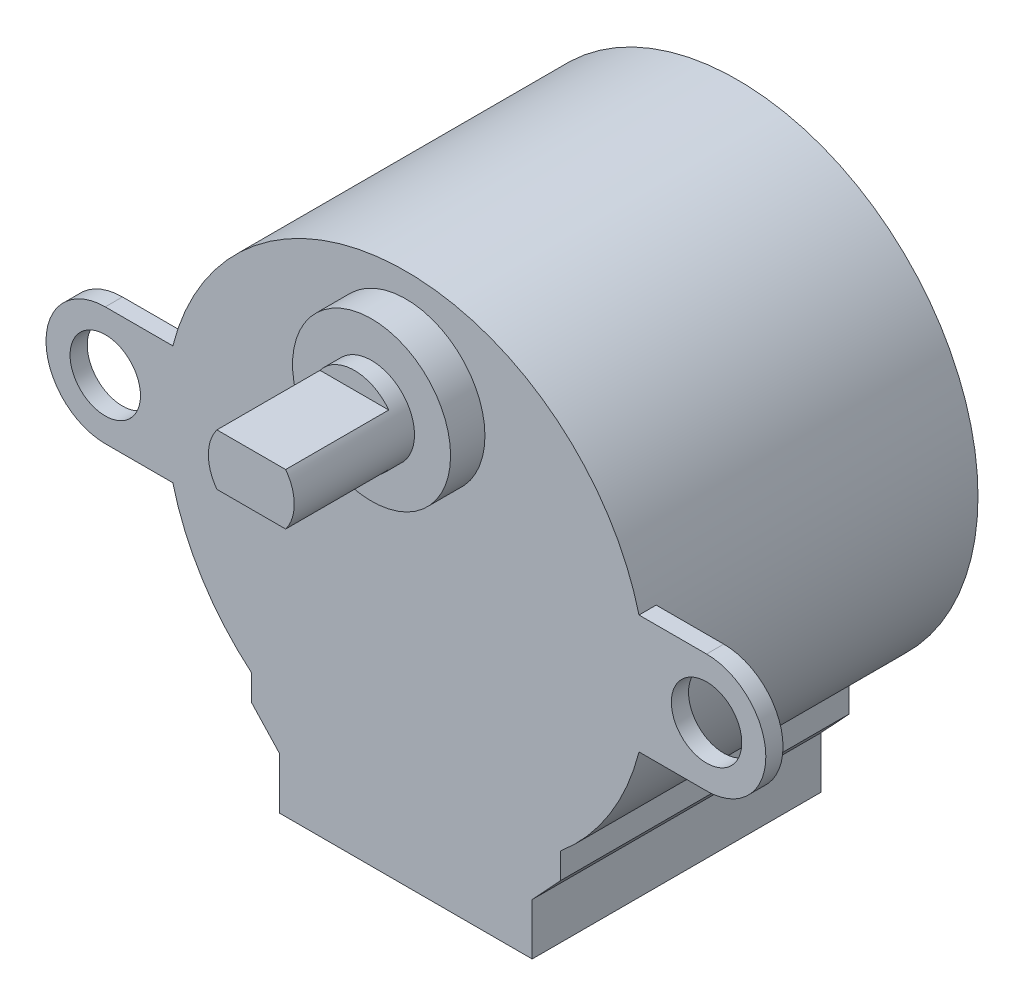
ISO-10303-21;
HEADER;
FILE_DESCRIPTION(('STEP AP214'),'2;1');
FILE_NAME('part.step','',(''),(''),'','','');
FILE_SCHEMA(('AUTOMOTIVE_DESIGN { 1 0 10303 214 1 1 1 1 }'));
ENDSEC;
DATA;
#1=APPLICATION_CONTEXT('core data for automotive mechanical design processes');
#2=APPLICATION_PROTOCOL_DEFINITION('international standard','automotive_design',2000,#1);
#3=PRODUCT_CONTEXT('',#1,'mechanical');
#4=PRODUCT('Part','Part','',(#3));
#5=PRODUCT_RELATED_PRODUCT_CATEGORY('part','',(#4));
#6=PRODUCT_DEFINITION_FORMATION('','',#4);
#7=PRODUCT_DEFINITION_CONTEXT('part definition',#1,'design');
#8=PRODUCT_DEFINITION('design','',#6,#7);
#9=PRODUCT_DEFINITION_SHAPE('','',#8);
#10=(LENGTH_UNIT() NAMED_UNIT(*) SI_UNIT(.MILLI.,.METRE.));
#11=(NAMED_UNIT(*) PLANE_ANGLE_UNIT() SI_UNIT($,.RADIAN.));
#12=(NAMED_UNIT(*) SI_UNIT($,.STERADIAN.) SOLID_ANGLE_UNIT());
#13=UNCERTAINTY_MEASURE_WITH_UNIT(LENGTH_MEASURE(1.E-05),#10,'distance_accuracy_value','');
#14=(GEOMETRIC_REPRESENTATION_CONTEXT(3) GLOBAL_UNCERTAINTY_ASSIGNED_CONTEXT((#13)) GLOBAL_UNIT_ASSIGNED_CONTEXT((#10,
#11,#12)) REPRESENTATION_CONTEXT('',''));
#15=CARTESIAN_POINT('',(0.,0.,0.));
#16=DIRECTION('',(0.,0.,1.));
#17=DIRECTION('',(1.,0.,0.));
#18=AXIS2_PLACEMENT_3D('',#15,#16,#17);
#19=CARTESIAN_POINT('',(0.,8.,28.3));
#20=DIRECTION('',(0.,0.,-1.));
#21=DIRECTION('',(-1.,0.,0.));
#22=AXIS2_PLACEMENT_3D('',#19,#20,#21);
#23=CYLINDRICAL_SURFACE('',#22,2.5);
#24=CARTESIAN_POINT('',(0.,8.,28.3));
#25=DIRECTION('',(0.,0.,1.));
#26=DIRECTION('',(1.,0.,0.));
#27=AXIS2_PLACEMENT_3D('',#24,#25,#26);
#28=CIRCLE('',#27,2.5);
#29=CARTESIAN_POINT('',(-2.,9.5,28.3));
#30=VERTEX_POINT('',#29);
#31=CARTESIAN_POINT('',(-2.,6.5,28.3));
#32=VERTEX_POINT('',#31);
#33=EDGE_CURVE('E216',#30,#32,#28,.T.);
#34=ORIENTED_EDGE('',*,*,#33,.F.);
#35=DIRECTION('',(0.,0.,1.));
#36=VECTOR('',#35,1.);
#37=CARTESIAN_POINT('',(-2.,9.5,22.3));
#38=LINE('',#37,#36);
#39=CARTESIAN_POINT('',(-2.,9.5,22.3));
#40=VERTEX_POINT('',#39);
#41=EDGE_CURVE('E63',#40,#30,#38,.T.);
#42=ORIENTED_EDGE('',*,*,#41,.F.);
#43=CARTESIAN_POINT('',(0.,8.,22.3));
#44=DIRECTION('',(0.,0.,1.));
#45=DIRECTION('',(1.,0.,0.));
#46=AXIS2_PLACEMENT_3D('',#43,#44,#45);
#47=CIRCLE('',#46,2.5);
#48=CARTESIAN_POINT('',(2.,9.5,22.3));
#49=VERTEX_POINT('',#48);
#50=EDGE_CURVE('E202',#49,#40,#47,.T.);
#51=ORIENTED_EDGE('',*,*,#50,.F.);
#52=DIRECTION('',(0.,0.,1.));
#53=VECTOR('',#52,1.);
#54=CARTESIAN_POINT('',(2.,9.5,22.3));
#55=LINE('',#54,#53);
#56=CARTESIAN_POINT('',(2.,9.5,28.3));
#57=VERTEX_POINT('',#56);
#58=EDGE_CURVE('E210',#49,#57,#55,.T.);
#59=ORIENTED_EDGE('',*,*,#58,.T.);
#60=CARTESIAN_POINT('',(2.,6.5,28.3));
#61=VERTEX_POINT('',#60);
#62=EDGE_CURVE('E218',#61,#57,#28,.T.);
#63=ORIENTED_EDGE('',*,*,#62,.F.);
#64=DIRECTION('',(0.,0.,1.));
#65=VECTOR('',#64,1.);
#66=CARTESIAN_POINT('',(2.,6.5,22.3));
#67=LINE('',#66,#65);
#68=CARTESIAN_POINT('',(2.,6.5,22.3));
#69=VERTEX_POINT('',#68);
#70=EDGE_CURVE('E55',#69,#61,#67,.T.);
#71=ORIENTED_EDGE('',*,*,#70,.F.);
#72=CARTESIAN_POINT('',(0.,8.,22.3));
#73=DIRECTION('',(0.,0.,1.));
#74=DIRECTION('',(1.,0.,0.));
#75=AXIS2_PLACEMENT_3D('',#72,#73,#74);
#76=CIRCLE('',#75,2.5);
#77=CARTESIAN_POINT('',(-2.,6.5,22.3));
#78=VERTEX_POINT('',#77);
#79=EDGE_CURVE('E224',#78,#69,#76,.T.);
#80=ORIENTED_EDGE('',*,*,#79,.F.);
#81=DIRECTION('',(0.,0.,1.));
#82=VECTOR('',#81,1.);
#83=CARTESIAN_POINT('',(-2.,6.5,22.3));
#84=LINE('',#83,#82);
#85=EDGE_CURVE('E228',#78,#32,#84,.T.);
#86=ORIENTED_EDGE('',*,*,#85,.T.);
#87=EDGE_LOOP('',(#34,#42,#51,#59,#63,#71,#80,#86));
#88=FACE_BOUND('',#87,.T.);
#89=CARTESIAN_POINT('',(0.,8.,21.3));
#90=DIRECTION('',(0.,0.,1.));
#91=DIRECTION('',(1.,0.,0.));
#92=AXIS2_PLACEMENT_3D('',#89,#90,#91);
#93=CIRCLE('',#92,2.5);
#94=CARTESIAN_POINT('',(2.5,8.,21.3));
#95=VERTEX_POINT('',#94);
#96=EDGE_CURVE('E11',#95,#95,#93,.T.);
#97=ORIENTED_EDGE('',*,*,#96,.T.);
#98=EDGE_LOOP('',(#97));
#99=FACE_BOUND('',#98,.T.);
#100=ADVANCED_FACE('F38',(#88,#99),#23,.T.);
#101=CARTESIAN_POINT('',(0.,8.,28.3));
#102=DIRECTION('',(0.,0.,1.));
#103=DIRECTION('',(1.,0.,0.));
#104=AXIS2_PLACEMENT_3D('',#101,#102,#103);
#105=PLANE('',#104);
#106=DIRECTION('',(1.,0.,0.));
#107=VECTOR('',#106,1.);
#108=CARTESIAN_POINT('',(0.,9.5,28.3));
#109=LINE('',#108,#107);
#110=EDGE_CURVE('E207',#30,#57,#109,.T.);
#111=ORIENTED_EDGE('',*,*,#110,.F.);
#112=ORIENTED_EDGE('',*,*,#33,.T.);
#113=DIRECTION('',(1.,0.,0.));
#114=VECTOR('',#113,1.);
#115=CARTESIAN_POINT('',(0.,6.5,28.3));
#116=LINE('',#115,#114);
#117=EDGE_CURVE('E225',#32,#61,#116,.T.);
#118=ORIENTED_EDGE('',*,*,#117,.T.);
#119=ORIENTED_EDGE('',*,*,#62,.T.);
#120=EDGE_LOOP('',(#111,#112,#118,#119));
#121=FACE_BOUND('',#120,.T.);
#122=ADVANCED_FACE('F426',(#121),#105,.T.);
#123=CARTESIAN_POINT('',(0.,0.,19.3));
#124=DIRECTION('',(0.,0.,-1.));
#125=DIRECTION('',(-1.,0.,0.));
#126=AXIS2_PLACEMENT_3D('',#123,#124,#125);
#127=CYLINDRICAL_SURFACE('',#126,14.);
#128=CARTESIAN_POINT('',(0.,0.,19.3));
#129=DIRECTION('',(0.,0.,1.));
#130=DIRECTION('',(1.,0.,0.));
#131=AXIS2_PLACEMENT_3D('',#128,#129,#130);
#132=CIRCLE('',#131,14.);
#133=CARTESIAN_POINT('',(13.5682533879641,3.45,19.3));
#134=VERTEX_POINT('',#133);
#135=CARTESIAN_POINT('',(-13.5682533879641,3.45,19.3));
#136=VERTEX_POINT('',#135);
#137=EDGE_CURVE('E402',#134,#136,#132,.T.);
#138=ORIENTED_EDGE('',*,*,#137,.F.);
#139=DIRECTION('',(0.,0.,1.));
#140=VECTOR('',#139,1.);
#141=CARTESIAN_POINT('',(13.5682533879641,3.45,18.3));
#142=LINE('',#141,#140);
#143=CARTESIAN_POINT('',(13.5682533879641,3.45,18.3));
#144=VERTEX_POINT('',#143);
#145=EDGE_CURVE('E237',#144,#134,#142,.T.);
#146=ORIENTED_EDGE('',*,*,#145,.F.);
#147=CARTESIAN_POINT('',(0.,0.,18.3));
#148=DIRECTION('',(0.,0.,-1.));
#149=DIRECTION('',(-1.,0.,0.));
#150=AXIS2_PLACEMENT_3D('',#147,#148,#149);
#151=CIRCLE('',#150,14.);
#152=CARTESIAN_POINT('',(13.5682533879641,-3.45,18.3));
#153=VERTEX_POINT('',#152);
#154=EDGE_CURVE('E254',#144,#153,#151,.T.);
#155=ORIENTED_EDGE('',*,*,#154,.T.);
#156=DIRECTION('',(0.,0.,1.));
#157=VECTOR('',#156,1.);
#158=CARTESIAN_POINT('',(13.5682533879641,-3.45,18.3));
#159=LINE('',#158,#157);
#160=CARTESIAN_POINT('',(13.5682533879641,-3.45,19.3));
#161=VERTEX_POINT('',#160);
#162=EDGE_CURVE('E241',#153,#161,#159,.T.);
#163=ORIENTED_EDGE('',*,*,#162,.T.);
#164=CARTESIAN_POINT('',(9.,-10.7238052947636,19.3));
#165=VERTEX_POINT('',#164);
#166=EDGE_CURVE('E47',#165,#161,#132,.T.);
#167=ORIENTED_EDGE('',*,*,#166,.F.);
#168=DIRECTION('',(0.,0.,1.));
#169=VECTOR('',#168,1.);
#170=CARTESIAN_POINT('',(9.,-10.7238052947636,2.5));
#171=LINE('',#170,#169);
#172=CARTESIAN_POINT('',(9.,-10.7238052947636,2.5));
#173=VERTEX_POINT('',#172);
#174=EDGE_CURVE('E394',#173,#165,#171,.T.);
#175=ORIENTED_EDGE('',*,*,#174,.F.);
#176=CARTESIAN_POINT('',(0.,0.,2.5));
#177=DIRECTION('',(0.,0.,1.));
#178=DIRECTION('',(1.,0.,0.));
#179=AXIS2_PLACEMENT_3D('',#176,#177,#178);
#180=CIRCLE('',#179,14.);
#181=CARTESIAN_POINT('',(-8.99999999999999,-10.7238052947636,2.5));
#182=VERTEX_POINT('',#181);
#183=EDGE_CURVE('E358',#182,#173,#180,.T.);
#184=ORIENTED_EDGE('',*,*,#183,.F.);
#185=DIRECTION('',(0.,0.,1.));
#186=VECTOR('',#185,1.);
#187=CARTESIAN_POINT('',(-8.99999999999999,-10.7238052947636,2.5));
#188=LINE('',#187,#186);
#189=CARTESIAN_POINT('',(-8.99999999999999,-10.7238052947636,19.3));
#190=VERTEX_POINT('',#189);
#191=EDGE_CURVE('E391',#182,#190,#188,.T.);
#192=ORIENTED_EDGE('',*,*,#191,.T.);
#193=CARTESIAN_POINT('',(-13.5682533879641,-3.45,19.3));
#194=VERTEX_POINT('',#193);
#195=EDGE_CURVE('E403',#194,#190,#132,.T.);
#196=ORIENTED_EDGE('',*,*,#195,.F.);
#197=DIRECTION('',(0.,0.,1.));
#198=VECTOR('',#197,1.);
#199=CARTESIAN_POINT('',(-13.5682533879641,-3.45,18.3));
#200=LINE('',#199,#198);
#201=CARTESIAN_POINT('',(-13.5682533879641,-3.45,18.3));
#202=VERTEX_POINT('',#201);
#203=EDGE_CURVE('E309',#202,#194,#200,.T.);
#204=ORIENTED_EDGE('',*,*,#203,.F.);
#205=CARTESIAN_POINT('',(0.,0.,18.3));
#206=DIRECTION('',(0.,0.,-1.));
#207=DIRECTION('',(1.,0.,0.));
#208=AXIS2_PLACEMENT_3D('',#205,#206,#207);
#209=CIRCLE('',#208,14.);
#210=CARTESIAN_POINT('',(-13.5682533879641,3.45,18.3));
#211=VERTEX_POINT('',#210);
#212=EDGE_CURVE('E290',#202,#211,#209,.T.);
#213=ORIENTED_EDGE('',*,*,#212,.T.);
#214=DIRECTION('',(0.,0.,1.));
#215=VECTOR('',#214,1.);
#216=CARTESIAN_POINT('',(-13.5682533879641,3.45,18.3));
#217=LINE('',#216,#215);
#218=EDGE_CURVE('E306',#211,#136,#217,.T.);
#219=ORIENTED_EDGE('',*,*,#218,.T.);
#220=EDGE_LOOP('',(#138,#146,#155,#163,#167,#175,#184,#192,#196,#204,#213,#219));
#221=FACE_BOUND('',#220,.T.);
#222=CARTESIAN_POINT('',(0.,0.,0.));
#223=DIRECTION('',(0.,0.,1.));
#224=DIRECTION('',(1.,0.,0.));
#225=AXIS2_PLACEMENT_3D('',#222,#223,#224);
#226=CIRCLE('',#225,14.);
#227=CARTESIAN_POINT('',(14.,0.,0.));
#228=VERTEX_POINT('',#227);
#229=EDGE_CURVE('E42',#228,#228,#226,.T.);
#230=ORIENTED_EDGE('',*,*,#229,.T.);
#231=EDGE_LOOP('',(#230));
#232=FACE_BOUND('',#231,.T.);
#233=ADVANCED_FACE('F40',(#221,#232),#127,.T.);
#234=CARTESIAN_POINT('',(0.,0.,19.3));
#235=DIRECTION('',(0.,0.,1.));
#236=DIRECTION('',(1.,0.,0.));
#237=AXIS2_PLACEMENT_3D('',#234,#235,#236);
#238=PLANE('',#237);
#239=CARTESIAN_POINT('',(0.,8.,19.3));
#240=DIRECTION('',(0.,0.,1.));
#241=DIRECTION('',(1.,0.,0.));
#242=AXIS2_PLACEMENT_3D('',#239,#240,#241);
#243=CIRCLE('',#242,4.6);
#244=CARTESIAN_POINT('',(4.6,8.,19.3));
#245=VERTEX_POINT('',#244);
#246=EDGE_CURVE('E238',#245,#245,#243,.T.);
#247=ORIENTED_EDGE('',*,*,#246,.F.);
#248=EDGE_LOOP('',(#247));
#249=FACE_BOUND('',#248,.T.);
#250=ORIENTED_EDGE('',*,*,#166,.T.);
#251=DIRECTION('',(1.,0.,0.));
#252=VECTOR('',#251,1.);
#253=CARTESIAN_POINT('',(17.5,-3.45,19.3));
#254=LINE('',#253,#252);
#255=CARTESIAN_POINT('',(17.5,-3.45,19.3));
#256=VERTEX_POINT('',#255);
#257=EDGE_CURVE('E257',#161,#256,#254,.T.);
#258=ORIENTED_EDGE('',*,*,#257,.T.);
#259=CARTESIAN_POINT('',(17.5,0.,19.3));
#260=DIRECTION('',(0.,0.,1.));
#261=DIRECTION('',(-1.,0.,0.));
#262=AXIS2_PLACEMENT_3D('',#259,#260,#261);
#263=CIRCLE('',#262,3.45);
#264=CARTESIAN_POINT('',(17.5,3.45,19.3));
#265=VERTEX_POINT('',#264);
#266=EDGE_CURVE('E253',#256,#265,#263,.T.);
#267=ORIENTED_EDGE('',*,*,#266,.T.);
#268=DIRECTION('',(-1.,0.,0.));
#269=VECTOR('',#268,1.);
#270=CARTESIAN_POINT('',(17.5,3.45,19.3));
#271=LINE('',#270,#269);
#272=EDGE_CURVE('E251',#265,#134,#271,.T.);
#273=ORIENTED_EDGE('',*,*,#272,.T.);
#274=ORIENTED_EDGE('',*,*,#137,.T.);
#275=DIRECTION('',(-1.,0.,0.));
#276=VECTOR('',#275,1.);
#277=CARTESIAN_POINT('',(-17.5,3.45,19.3));
#278=LINE('',#277,#276);
#279=CARTESIAN_POINT('',(-17.5,3.45,19.3));
#280=VERTEX_POINT('',#279);
#281=EDGE_CURVE('E287',#136,#280,#278,.T.);
#282=ORIENTED_EDGE('',*,*,#281,.T.);
#283=CARTESIAN_POINT('',(-17.5,0.,19.3));
#284=DIRECTION('',(0.,0.,1.));
#285=DIRECTION('',(1.,0.,0.));
#286=AXIS2_PLACEMENT_3D('',#283,#284,#285);
#287=CIRCLE('',#286,3.45);
#288=CARTESIAN_POINT('',(-17.5,-3.45,19.3));
#289=VERTEX_POINT('',#288);
#290=EDGE_CURVE('E280',#280,#289,#287,.T.);
#291=ORIENTED_EDGE('',*,*,#290,.T.);
#292=DIRECTION('',(1.,0.,0.));
#293=VECTOR('',#292,1.);
#294=CARTESIAN_POINT('',(-17.5,-3.45,19.3));
#295=LINE('',#294,#293);
#296=EDGE_CURVE('E299',#289,#194,#295,.T.);
#297=ORIENTED_EDGE('',*,*,#296,.T.);
#298=ORIENTED_EDGE('',*,*,#195,.T.);
#299=DIRECTION('',(0.,1.,0.));
#300=VECTOR('',#299,1.);
#301=CARTESIAN_POINT('',(-9.,-12.2238052947636,19.3));
#302=LINE('',#301,#300);
#303=CARTESIAN_POINT('',(-9.,-12.2238052947636,19.3));
#304=VERTEX_POINT('',#303);
#305=EDGE_CURVE('E377',#304,#190,#302,.T.);
#306=ORIENTED_EDGE('',*,*,#305,.F.);
#307=DIRECTION('',(-0.68060089492241,0.732654367236567,0.));
#308=VECTOR('',#307,1.);
#309=CARTESIAN_POINT('',(-7.35,-14.,19.3));
#310=LINE('',#309,#308);
#311=CARTESIAN_POINT('',(-7.35,-14.,19.3));
#312=VERTEX_POINT('',#311);
#313=EDGE_CURVE('E380',#312,#304,#310,.T.);
#314=ORIENTED_EDGE('',*,*,#313,.F.);
#315=DIRECTION('',(0.,1.,0.));
#316=VECTOR('',#315,1.);
#317=CARTESIAN_POINT('',(-7.35,-17.,19.3));
#318=LINE('',#317,#316);
#319=CARTESIAN_POINT('',(-7.35,-17.,19.3));
#320=VERTEX_POINT('',#319);
#321=EDGE_CURVE('E349',#320,#312,#318,.T.);
#322=ORIENTED_EDGE('',*,*,#321,.F.);
#323=DIRECTION('',(1.,0.,0.));
#324=VECTOR('',#323,1.);
#325=CARTESIAN_POINT('',(-7.35,-17.,19.3));
#326=LINE('',#325,#324);
#327=CARTESIAN_POINT('',(7.35,-17.,19.3));
#328=VERTEX_POINT('',#327);
#329=EDGE_CURVE('E338',#320,#328,#326,.T.);
#330=ORIENTED_EDGE('',*,*,#329,.T.);
#331=DIRECTION('',(0.,1.,0.));
#332=VECTOR('',#331,1.);
#333=CARTESIAN_POINT('',(7.35,-17.,19.3));
#334=LINE('',#333,#332);
#335=CARTESIAN_POINT('',(7.35,-14.,19.3));
#336=VERTEX_POINT('',#335);
#337=EDGE_CURVE('E369',#328,#336,#334,.T.);
#338=ORIENTED_EDGE('',*,*,#337,.T.);
#339=DIRECTION('',(0.68060089492241,0.732654367236567,0.));
#340=VECTOR('',#339,1.);
#341=CARTESIAN_POINT('',(7.35,-14.,19.3));
#342=LINE('',#341,#340);
#343=CARTESIAN_POINT('',(9.,-12.2238052947636,19.3));
#344=VERTEX_POINT('',#343);
#345=EDGE_CURVE('E372',#336,#344,#342,.T.);
#346=ORIENTED_EDGE('',*,*,#345,.T.);
#347=DIRECTION('',(0.,1.,0.));
#348=VECTOR('',#347,1.);
#349=CARTESIAN_POINT('',(9.,-12.2238052947636,19.3));
#350=LINE('',#349,#348);
#351=EDGE_CURVE('E375',#344,#165,#350,.T.);
#352=ORIENTED_EDGE('',*,*,#351,.T.);
#353=EDGE_LOOP('',(#250,#258,#267,#273,#274,#282,#291,#297,#298,#306,#314,#322,#330,#338,#346,#352));
#354=FACE_BOUND('',#353,.T.);
#355=CARTESIAN_POINT('',(-17.5,0.,19.3));
#356=DIRECTION('',(0.,0.,1.));
#357=DIRECTION('',(1.,0.,0.));
#358=AXIS2_PLACEMENT_3D('',#355,#356,#357);
#359=CIRCLE('',#358,2.05);
#360=CARTESIAN_POINT('',(-15.45,0.,19.3));
#361=VERTEX_POINT('',#360);
#362=EDGE_CURVE('E274',#361,#361,#359,.T.);
#363=ORIENTED_EDGE('',*,*,#362,.F.);
#364=EDGE_LOOP('',(#363));
#365=FACE_BOUND('',#364,.T.);
#366=CARTESIAN_POINT('',(17.5,0.,19.3));
#367=DIRECTION('',(0.,0.,1.));
#368=DIRECTION('',(-1.,0.,0.));
#369=AXIS2_PLACEMENT_3D('',#366,#367,#368);
#370=CIRCLE('',#369,2.05);
#371=CARTESIAN_POINT('',(15.45,0.,19.3));
#372=VERTEX_POINT('',#371);
#373=EDGE_CURVE('E271',#372,#372,#370,.T.);
#374=ORIENTED_EDGE('',*,*,#373,.F.);
#375=EDGE_LOOP('',(#374));
#376=FACE_BOUND('',#375,.T.);
#377=ADVANCED_FACE('F415',(#249,#354,#365,#376),#238,.T.);
#378=CARTESIAN_POINT('',(0.,0.,0.));
#379=DIRECTION('',(0.,0.,1.));
#380=DIRECTION('',(1.,0.,0.));
#381=AXIS2_PLACEMENT_3D('',#378,#379,#380);
#382=PLANE('',#381);
#383=ORIENTED_EDGE('',*,*,#229,.F.);
#384=EDGE_LOOP('',(#383));
#385=FACE_BOUND('',#384,.T.);
#386=ADVANCED_FACE('F412',(#385),#382,.F.);
#387=CARTESIAN_POINT('',(-7.35,-17.,2.5));
#388=DIRECTION('',(0.,-1.,0.));
#389=DIRECTION('',(0.,0.,-1.));
#390=AXIS2_PLACEMENT_3D('',#387,#388,#389);
#391=PLANE('',#390);
#392=CARTESIAN_POINT('',(-3.,-17.,17.55));
#393=DIRECTION('',(0.,-1.,0.));
#394=DIRECTION('',(0.,0.,-1.));
#395=AXIS2_PLACEMENT_3D('',#392,#393,#394);
#396=CIRCLE('',#395,0.500000000000004);
#397=CARTESIAN_POINT('',(-3.,-17.,18.05));
#398=VERTEX_POINT('',#397);
#399=CARTESIAN_POINT('',(-3.,-17.,17.05));
#400=VERTEX_POINT('',#399);
#401=EDGE_CURVE('E305',#398,#400,#396,.T.);
#402=ORIENTED_EDGE('',*,*,#401,.F.);
#403=DIRECTION('',(-1.,0.,0.));
#404=VECTOR('',#403,1.);
#405=CARTESIAN_POINT('',(-3.,-17.,18.05));
#406=LINE('',#405,#404);
#407=CARTESIAN_POINT('',(3.,-17.,18.05));
#408=VERTEX_POINT('',#407);
#409=EDGE_CURVE('E317',#408,#398,#406,.T.);
#410=ORIENTED_EDGE('',*,*,#409,.F.);
#411=CARTESIAN_POINT('',(3.,-17.,17.55));
#412=DIRECTION('',(0.,-1.,0.));
#413=DIRECTION('',(0.,0.,-1.));
#414=AXIS2_PLACEMENT_3D('',#411,#412,#413);
#415=CIRCLE('',#414,0.500000000000004);
#416=CARTESIAN_POINT('',(3.,-17.,17.05));
#417=VERTEX_POINT('',#416);
#418=EDGE_CURVE('E331',#417,#408,#415,.T.);
#419=ORIENTED_EDGE('',*,*,#418,.F.);
#420=DIRECTION('',(1.,0.,0.));
#421=VECTOR('',#420,1.);
#422=CARTESIAN_POINT('',(-3.,-17.,17.05));
#423=LINE('',#422,#421);
#424=EDGE_CURVE('E328',#400,#417,#423,.T.);
#425=ORIENTED_EDGE('',*,*,#424,.F.);
#426=EDGE_LOOP('',(#402,#410,#419,#425));
#427=FACE_BOUND('',#426,.T.);
#428=ORIENTED_EDGE('',*,*,#329,.F.);
#429=DIRECTION('',(0.,0.,1.));
#430=VECTOR('',#429,1.);
#431=CARTESIAN_POINT('',(-7.35,-17.,2.5));
#432=LINE('',#431,#430);
#433=CARTESIAN_POINT('',(-7.35,-17.,2.5));
#434=VERTEX_POINT('',#433);
#435=EDGE_CURVE('E383',#434,#320,#432,.T.);
#436=ORIENTED_EDGE('',*,*,#435,.F.);
#437=DIRECTION('',(1.,0.,0.));
#438=VECTOR('',#437,1.);
#439=CARTESIAN_POINT('',(-7.35,-17.,2.5));
#440=LINE('',#439,#438);
#441=CARTESIAN_POINT('',(7.35,-17.,2.5));
#442=VERTEX_POINT('',#441);
#443=EDGE_CURVE('E345',#434,#442,#440,.T.);
#444=ORIENTED_EDGE('',*,*,#443,.T.);
#445=DIRECTION('',(0.,0.,1.));
#446=VECTOR('',#445,1.);
#447=CARTESIAN_POINT('',(7.35,-17.,2.5));
#448=LINE('',#447,#446);
#449=EDGE_CURVE('E366',#442,#328,#448,.T.);
#450=ORIENTED_EDGE('',*,*,#449,.T.);
#451=EDGE_LOOP('',(#428,#436,#444,#450));
#452=FACE_BOUND('',#451,.T.);
#453=ADVANCED_FACE('F414',(#427,#452),#391,.T.);
#454=CARTESIAN_POINT('',(-7.35,-17.,2.5));
#455=DIRECTION('',(1.,0.,0.));
#456=DIRECTION('',(0.,0.,-1.));
#457=AXIS2_PLACEMENT_3D('',#454,#455,#456);
#458=PLANE('',#457);
#459=ORIENTED_EDGE('',*,*,#321,.T.);
#460=DIRECTION('',(0.,0.,1.));
#461=VECTOR('',#460,1.);
#462=CARTESIAN_POINT('',(-7.35,-14.,2.5));
#463=LINE('',#462,#461);
#464=CARTESIAN_POINT('',(-7.35,-14.,2.5));
#465=VERTEX_POINT('',#464);
#466=EDGE_CURVE('E385',#465,#312,#463,.T.);
#467=ORIENTED_EDGE('',*,*,#466,.F.);
#468=DIRECTION('',(0.,1.,0.));
#469=VECTOR('',#468,1.);
#470=CARTESIAN_POINT('',(-7.35,-17.,2.5));
#471=LINE('',#470,#469);
#472=EDGE_CURVE('E364',#434,#465,#471,.T.);
#473=ORIENTED_EDGE('',*,*,#472,.F.);
#474=ORIENTED_EDGE('',*,*,#435,.T.);
#475=EDGE_LOOP('',(#459,#467,#473,#474));
#476=FACE_BOUND('',#475,.T.);
#477=ADVANCED_FACE('F420',(#476),#458,.F.);
#478=CARTESIAN_POINT('',(-7.35,-14.,2.5));
#479=DIRECTION('',(0.732654367236567,0.68060089492241,0.));
#480=DIRECTION('',(-0.68060089492241,0.732654367236567,0.));
#481=AXIS2_PLACEMENT_3D('',#478,#479,#480);
#482=PLANE('',#481);
#483=ORIENTED_EDGE('',*,*,#313,.T.);
#484=DIRECTION('',(0.,0.,1.));
#485=VECTOR('',#484,1.);
#486=CARTESIAN_POINT('',(-9.,-12.2238052947636,2.5));
#487=LINE('',#486,#485);
#488=CARTESIAN_POINT('',(-9.,-12.2238052947636,2.5));
#489=VERTEX_POINT('',#488);
#490=EDGE_CURVE('E388',#489,#304,#487,.T.);
#491=ORIENTED_EDGE('',*,*,#490,.F.);
#492=DIRECTION('',(-0.68060089492241,0.732654367236567,0.));
#493=VECTOR('',#492,1.);
#494=CARTESIAN_POINT('',(-7.35,-14.,2.5));
#495=LINE('',#494,#493);
#496=EDGE_CURVE('E362',#465,#489,#495,.T.);
#497=ORIENTED_EDGE('',*,*,#496,.F.);
#498=ORIENTED_EDGE('',*,*,#466,.T.);
#499=EDGE_LOOP('',(#483,#491,#497,#498));
#500=FACE_BOUND('',#499,.T.);
#501=ADVANCED_FACE('F511',(#500),#482,.F.);
#502=CARTESIAN_POINT('',(-9.,-12.2238052947636,2.5));
#503=DIRECTION('',(1.,0.,0.));
#504=DIRECTION('',(0.,0.,-1.));
#505=AXIS2_PLACEMENT_3D('',#502,#503,#504);
#506=PLANE('',#505);
#507=ORIENTED_EDGE('',*,*,#305,.T.);
#508=ORIENTED_EDGE('',*,*,#191,.F.);
#509=DIRECTION('',(0.,1.,0.));
#510=VECTOR('',#509,1.);
#511=CARTESIAN_POINT('',(-9.,-12.2238052947636,2.5));
#512=LINE('',#511,#510);
#513=EDGE_CURVE('E360',#489,#182,#512,.T.);
#514=ORIENTED_EDGE('',*,*,#513,.F.);
#515=ORIENTED_EDGE('',*,*,#490,.T.);
#516=EDGE_LOOP('',(#507,#508,#514,#515));
#517=FACE_BOUND('',#516,.T.);
#518=ADVANCED_FACE('F515',(#517),#506,.F.);
#519=CARTESIAN_POINT('',(9.,-12.2238052947636,2.5));
#520=DIRECTION('',(1.,0.,0.));
#521=DIRECTION('',(0.,0.,-1.));
#522=AXIS2_PLACEMENT_3D('',#519,#520,#521);
#523=PLANE('',#522);
#524=ORIENTED_EDGE('',*,*,#351,.F.);
#525=DIRECTION('',(0.,0.,1.));
#526=VECTOR('',#525,1.);
#527=CARTESIAN_POINT('',(9.,-12.2238052947636,2.5));
#528=LINE('',#527,#526);
#529=CARTESIAN_POINT('',(9.,-12.2238052947636,2.5));
#530=VERTEX_POINT('',#529);
#531=EDGE_CURVE('E397',#530,#344,#528,.T.);
#532=ORIENTED_EDGE('',*,*,#531,.F.);
#533=DIRECTION('',(0.,1.,0.));
#534=VECTOR('',#533,1.);
#535=CARTESIAN_POINT('',(9.,-12.2238052947636,2.5));
#536=LINE('',#535,#534);
#537=EDGE_CURVE('E355',#530,#173,#536,.T.);
#538=ORIENTED_EDGE('',*,*,#537,.T.);
#539=ORIENTED_EDGE('',*,*,#174,.T.);
#540=EDGE_LOOP('',(#524,#532,#538,#539));
#541=FACE_BOUND('',#540,.T.);
#542=ADVANCED_FACE('F519',(#541),#523,.T.);
#543=CARTESIAN_POINT('',(7.35,-14.,2.5));
#544=DIRECTION('',(0.732654367236567,-0.68060089492241,0.));
#545=DIRECTION('',(0.68060089492241,0.732654367236567,0.));
#546=AXIS2_PLACEMENT_3D('',#543,#544,#545);
#547=PLANE('',#546);
#548=ORIENTED_EDGE('',*,*,#345,.F.);
#549=DIRECTION('',(0.,0.,1.));
#550=VECTOR('',#549,1.);
#551=CARTESIAN_POINT('',(7.35,-14.,2.5));
#552=LINE('',#551,#550);
#553=CARTESIAN_POINT('',(7.35,-14.,2.5));
#554=VERTEX_POINT('',#553);
#555=EDGE_CURVE('E399',#554,#336,#552,.T.);
#556=ORIENTED_EDGE('',*,*,#555,.F.);
#557=DIRECTION('',(0.68060089492241,0.732654367236567,0.));
#558=VECTOR('',#557,1.);
#559=CARTESIAN_POINT('',(7.35,-14.,2.5));
#560=LINE('',#559,#558);
#561=EDGE_CURVE('E352',#554,#530,#560,.T.);
#562=ORIENTED_EDGE('',*,*,#561,.T.);
#563=ORIENTED_EDGE('',*,*,#531,.T.);
#564=EDGE_LOOP('',(#548,#556,#562,#563));
#565=FACE_BOUND('',#564,.T.);
#566=ADVANCED_FACE('F523',(#565),#547,.T.);
#567=CARTESIAN_POINT('',(7.35,-17.,2.5));
#568=DIRECTION('',(1.,0.,0.));
#569=DIRECTION('',(0.,0.,-1.));
#570=AXIS2_PLACEMENT_3D('',#567,#568,#569);
#571=PLANE('',#570);
#572=ORIENTED_EDGE('',*,*,#337,.F.);
#573=ORIENTED_EDGE('',*,*,#449,.F.);
#574=DIRECTION('',(0.,1.,0.));
#575=VECTOR('',#574,1.);
#576=CARTESIAN_POINT('',(7.35,-17.,2.5));
#577=LINE('',#576,#575);
#578=EDGE_CURVE('E348',#442,#554,#577,.T.);
#579=ORIENTED_EDGE('',*,*,#578,.T.);
#580=ORIENTED_EDGE('',*,*,#555,.T.);
#581=EDGE_LOOP('',(#572,#573,#579,#580));
#582=FACE_BOUND('',#581,.T.);
#583=ADVANCED_FACE('F507',(#582),#571,.T.);
#584=CARTESIAN_POINT('',(0.,0.,2.5));
#585=DIRECTION('',(0.,0.,1.));
#586=DIRECTION('',(1.,0.,0.));
#587=AXIS2_PLACEMENT_3D('',#584,#585,#586);
#588=PLANE('',#587);
#589=ORIENTED_EDGE('',*,*,#443,.F.);
#590=ORIENTED_EDGE('',*,*,#472,.T.);
#591=ORIENTED_EDGE('',*,*,#496,.T.);
#592=ORIENTED_EDGE('',*,*,#513,.T.);
#593=ORIENTED_EDGE('',*,*,#183,.T.);
#594=ORIENTED_EDGE('',*,*,#537,.F.);
#595=ORIENTED_EDGE('',*,*,#561,.F.);
#596=ORIENTED_EDGE('',*,*,#578,.F.);
#597=EDGE_LOOP('',(#589,#590,#591,#592,#593,#594,#595,#596));
#598=FACE_BOUND('',#597,.T.);
#599=ADVANCED_FACE('F503',(#598),#588,.F.);
#600=CARTESIAN_POINT('',(-3.,-15.,17.55));
#601=DIRECTION('',(0.,-1.,0.));
#602=DIRECTION('',(0.,0.,-1.));
#603=AXIS2_PLACEMENT_3D('',#600,#601,#602);
#604=CYLINDRICAL_SURFACE('',#603,0.500000000000004);
#605=ORIENTED_EDGE('',*,*,#401,.T.);
#606=DIRECTION('',(0.,-1.,0.));
#607=VECTOR('',#606,1.);
#608=CARTESIAN_POINT('',(-3.,-15.,17.05));
#609=LINE('',#608,#607);
#610=CARTESIAN_POINT('',(-3.,-15.,17.05));
#611=VERTEX_POINT('',#610);
#612=EDGE_CURVE('E326',#611,#400,#609,.T.);
#613=ORIENTED_EDGE('',*,*,#612,.F.);
#614=CARTESIAN_POINT('',(-3.,-15.,17.55));
#615=DIRECTION('',(0.,-1.,0.));
#616=DIRECTION('',(0.,0.,-1.));
#617=AXIS2_PLACEMENT_3D('',#614,#615,#616);
#618=CIRCLE('',#617,0.500000000000004);
#619=CARTESIAN_POINT('',(-3.,-15.,18.05));
#620=VERTEX_POINT('',#619);
#621=EDGE_CURVE('E313',#620,#611,#618,.T.);
#622=ORIENTED_EDGE('',*,*,#621,.F.);
#623=DIRECTION('',(0.,-1.,0.));
#624=VECTOR('',#623,1.);
#625=CARTESIAN_POINT('',(-3.,-15.,18.05));
#626=LINE('',#625,#624);
#627=EDGE_CURVE('E336',#620,#398,#626,.T.);
#628=ORIENTED_EDGE('',*,*,#627,.T.);
#629=EDGE_LOOP('',(#605,#613,#622,#628));
#630=FACE_BOUND('',#629,.T.);
#631=ADVANCED_FACE('F493',(#630),#604,.F.);
#632=CARTESIAN_POINT('',(-3.,-15.,18.05));
#633=DIRECTION('',(0.,0.,1.));
#634=DIRECTION('',(1.,0.,0.));
#635=AXIS2_PLACEMENT_3D('',#632,#633,#634);
#636=PLANE('',#635);
#637=ORIENTED_EDGE('',*,*,#409,.T.);
#638=ORIENTED_EDGE('',*,*,#627,.F.);
#639=DIRECTION('',(-1.,0.,0.));
#640=VECTOR('',#639,1.);
#641=CARTESIAN_POINT('',(-3.,-15.,18.05));
#642=LINE('',#641,#640);
#643=CARTESIAN_POINT('',(3.,-15.,18.05));
#644=VERTEX_POINT('',#643);
#645=EDGE_CURVE('E323',#644,#620,#642,.T.);
#646=ORIENTED_EDGE('',*,*,#645,.F.);
#647=DIRECTION('',(0.,-1.,0.));
#648=VECTOR('',#647,1.);
#649=CARTESIAN_POINT('',(3.,-15.,18.05));
#650=LINE('',#649,#648);
#651=EDGE_CURVE('E339',#644,#408,#650,.T.);
#652=ORIENTED_EDGE('',*,*,#651,.T.);
#653=EDGE_LOOP('',(#637,#638,#646,#652));
#654=FACE_BOUND('',#653,.T.);
#655=ADVANCED_FACE('F489',(#654),#636,.F.);
#656=CARTESIAN_POINT('',(3.,-15.,17.55));
#657=DIRECTION('',(0.,-1.,0.));
#658=DIRECTION('',(0.,0.,-1.));
#659=AXIS2_PLACEMENT_3D('',#656,#657,#658);
#660=CYLINDRICAL_SURFACE('',#659,0.500000000000004);
#661=ORIENTED_EDGE('',*,*,#418,.T.);
#662=ORIENTED_EDGE('',*,*,#651,.F.);
#663=CARTESIAN_POINT('',(3.,-15.,17.55));
#664=DIRECTION('',(0.,-1.,0.));
#665=DIRECTION('',(0.,0.,-1.));
#666=AXIS2_PLACEMENT_3D('',#663,#664,#665);
#667=CIRCLE('',#666,0.500000000000004);
#668=CARTESIAN_POINT('',(3.,-15.,17.05));
#669=VERTEX_POINT('',#668);
#670=EDGE_CURVE('E320',#669,#644,#667,.T.);
#671=ORIENTED_EDGE('',*,*,#670,.F.);
#672=DIRECTION('',(0.,-1.,0.));
#673=VECTOR('',#672,1.);
#674=CARTESIAN_POINT('',(3.,-15.,17.05));
#675=LINE('',#674,#673);
#676=EDGE_CURVE('E341',#669,#417,#675,.T.);
#677=ORIENTED_EDGE('',*,*,#676,.T.);
#678=EDGE_LOOP('',(#661,#662,#671,#677));
#679=FACE_BOUND('',#678,.T.);
#680=ADVANCED_FACE('F492',(#679),#660,.F.);
#681=CARTESIAN_POINT('',(-3.,-15.,17.05));
#682=DIRECTION('',(0.,0.,-1.));
#683=DIRECTION('',(-1.,0.,0.));
#684=AXIS2_PLACEMENT_3D('',#681,#682,#683);
#685=PLANE('',#684);
#686=ORIENTED_EDGE('',*,*,#424,.T.);
#687=ORIENTED_EDGE('',*,*,#676,.F.);
#688=DIRECTION('',(1.,0.,0.));
#689=VECTOR('',#688,1.);
#690=CARTESIAN_POINT('',(-3.,-15.,17.05));
#691=LINE('',#690,#689);
#692=EDGE_CURVE('E316',#611,#669,#691,.T.);
#693=ORIENTED_EDGE('',*,*,#692,.F.);
#694=ORIENTED_EDGE('',*,*,#612,.T.);
#695=EDGE_LOOP('',(#686,#687,#693,#694));
#696=FACE_BOUND('',#695,.T.);
#697=ADVANCED_FACE('F487',(#696),#685,.F.);
#698=CARTESIAN_POINT('',(-3.,-15.,17.55));
#699=DIRECTION('',(0.,-1.,0.));
#700=DIRECTION('',(0.,0.,-1.));
#701=AXIS2_PLACEMENT_3D('',#698,#699,#700);
#702=PLANE('',#701);
#703=ORIENTED_EDGE('',*,*,#621,.T.);
#704=ORIENTED_EDGE('',*,*,#692,.T.);
#705=ORIENTED_EDGE('',*,*,#670,.T.);
#706=ORIENTED_EDGE('',*,*,#645,.T.);
#707=EDGE_LOOP('',(#703,#704,#705,#706));
#708=FACE_BOUND('',#707,.T.);
#709=ADVANCED_FACE('F483',(#708),#702,.T.);
#710=CARTESIAN_POINT('',(-17.5,0.,18.3));
#711=DIRECTION('',(0.,0.,1.));
#712=DIRECTION('',(1.,0.,0.));
#713=AXIS2_PLACEMENT_3D('',#710,#711,#712);
#714=CYLINDRICAL_SURFACE('',#713,3.45);
#715=ORIENTED_EDGE('',*,*,#290,.F.);
#716=DIRECTION('',(0.,0.,1.));
#717=VECTOR('',#716,1.);
#718=CARTESIAN_POINT('',(-17.5,3.45,18.3));
#719=LINE('',#718,#717);
#720=CARTESIAN_POINT('',(-17.5,3.45,18.3));
#721=VERTEX_POINT('',#720);
#722=EDGE_CURVE('E303',#721,#280,#719,.T.);
#723=ORIENTED_EDGE('',*,*,#722,.F.);
#724=CARTESIAN_POINT('',(-17.5,0.,18.3));
#725=DIRECTION('',(0.,0.,1.));
#726=DIRECTION('',(1.,0.,0.));
#727=AXIS2_PLACEMENT_3D('',#724,#725,#726);
#728=CIRCLE('',#727,3.45);
#729=CARTESIAN_POINT('',(-17.5,-3.45,18.3));
#730=VERTEX_POINT('',#729);
#731=EDGE_CURVE('E283',#721,#730,#728,.T.);
#732=ORIENTED_EDGE('',*,*,#731,.T.);
#733=DIRECTION('',(0.,0.,1.));
#734=VECTOR('',#733,1.);
#735=CARTESIAN_POINT('',(-17.5,-3.45,18.3));
#736=LINE('',#735,#734);
#737=EDGE_CURVE('E296',#730,#289,#736,.T.);
#738=ORIENTED_EDGE('',*,*,#737,.T.);
#739=EDGE_LOOP('',(#715,#723,#732,#738));
#740=FACE_BOUND('',#739,.T.);
#741=ADVANCED_FACE('F476',(#740),#714,.T.);
#742=CARTESIAN_POINT('',(-17.5,3.45,18.3));
#743=DIRECTION('',(0.,1.,0.));
#744=DIRECTION('',(0.,0.,1.));
#745=AXIS2_PLACEMENT_3D('',#742,#743,#744);
#746=PLANE('',#745);
#747=ORIENTED_EDGE('',*,*,#281,.F.);
#748=ORIENTED_EDGE('',*,*,#218,.F.);
#749=DIRECTION('',(-1.,0.,0.));
#750=VECTOR('',#749,1.);
#751=CARTESIAN_POINT('',(-17.5,3.45,18.3));
#752=LINE('',#751,#750);
#753=EDGE_CURVE('E293',#211,#721,#752,.T.);
#754=ORIENTED_EDGE('',*,*,#753,.T.);
#755=ORIENTED_EDGE('',*,*,#722,.T.);
#756=EDGE_LOOP('',(#747,#748,#754,#755));
#757=FACE_BOUND('',#756,.T.);
#758=ADVANCED_FACE('F473',(#757),#746,.T.);
#759=CARTESIAN_POINT('',(-17.5,-3.45,18.3));
#760=DIRECTION('',(0.,-1.,0.));
#761=DIRECTION('',(0.,0.,-1.));
#762=AXIS2_PLACEMENT_3D('',#759,#760,#761);
#763=PLANE('',#762);
#764=ORIENTED_EDGE('',*,*,#296,.F.);
#765=ORIENTED_EDGE('',*,*,#737,.F.);
#766=DIRECTION('',(1.,0.,0.));
#767=VECTOR('',#766,1.);
#768=CARTESIAN_POINT('',(-17.5,-3.45,18.3));
#769=LINE('',#768,#767);
#770=EDGE_CURVE('E286',#730,#202,#769,.T.);
#771=ORIENTED_EDGE('',*,*,#770,.T.);
#772=ORIENTED_EDGE('',*,*,#203,.T.);
#773=EDGE_LOOP('',(#764,#765,#771,#772));
#774=FACE_BOUND('',#773,.T.);
#775=ADVANCED_FACE('F471',(#774),#763,.T.);
#776=CARTESIAN_POINT('',(-17.5,0.,18.3));
#777=DIRECTION('',(0.,0.,1.));
#778=DIRECTION('',(1.,0.,0.));
#779=AXIS2_PLACEMENT_3D('',#776,#777,#778);
#780=PLANE('',#779);
#781=CARTESIAN_POINT('',(-17.5,0.,18.3));
#782=DIRECTION('',(0.,0.,1.));
#783=DIRECTION('',(1.,0.,0.));
#784=AXIS2_PLACEMENT_3D('',#781,#782,#783);
#785=CIRCLE('',#784,2.05);
#786=CARTESIAN_POINT('',(-15.45,0.,18.3));
#787=VERTEX_POINT('',#786);
#788=EDGE_CURVE('E277',#787,#787,#785,.T.);
#789=ORIENTED_EDGE('',*,*,#788,.T.);
#790=EDGE_LOOP('',(#789));
#791=FACE_BOUND('',#790,.T.);
#792=ORIENTED_EDGE('',*,*,#731,.F.);
#793=ORIENTED_EDGE('',*,*,#753,.F.);
#794=ORIENTED_EDGE('',*,*,#212,.F.);
#795=ORIENTED_EDGE('',*,*,#770,.F.);
#796=EDGE_LOOP('',(#792,#793,#794,#795));
#797=FACE_BOUND('',#796,.T.);
#798=ADVANCED_FACE('F467',(#791,#797),#780,.F.);
#799=CARTESIAN_POINT('',(-17.5,0.,18.3));
#800=DIRECTION('',(0.,0.,1.));
#801=DIRECTION('',(1.,0.,0.));
#802=AXIS2_PLACEMENT_3D('',#799,#800,#801);
#803=CYLINDRICAL_SURFACE('',#802,2.05);
#804=ORIENTED_EDGE('',*,*,#788,.F.);
#805=EDGE_LOOP('',(#804));
#806=FACE_BOUND('',#805,.T.);
#807=ORIENTED_EDGE('',*,*,#362,.T.);
#808=EDGE_LOOP('',(#807));
#809=FACE_BOUND('',#808,.T.);
#810=ADVANCED_FACE('F457',(#806,#809),#803,.F.);
#811=CARTESIAN_POINT('',(17.5,3.45,18.3));
#812=DIRECTION('',(0.,1.,0.));
#813=DIRECTION('',(0.,0.,1.));
#814=AXIS2_PLACEMENT_3D('',#811,#812,#813);
#815=PLANE('',#814);
#816=ORIENTED_EDGE('',*,*,#272,.F.);
#817=DIRECTION('',(0.,0.,1.));
#818=VECTOR('',#817,1.);
#819=CARTESIAN_POINT('',(17.5,3.45,18.3));
#820=LINE('',#819,#818);
#821=CARTESIAN_POINT('',(17.5,3.45,18.3));
#822=VERTEX_POINT('',#821);
#823=EDGE_CURVE('E247',#822,#265,#820,.T.);
#824=ORIENTED_EDGE('',*,*,#823,.F.);
#825=DIRECTION('',(-1.,0.,0.));
#826=VECTOR('',#825,1.);
#827=CARTESIAN_POINT('',(17.5,3.45,18.3));
#828=LINE('',#827,#826);
#829=EDGE_CURVE('E244',#822,#144,#828,.T.);
#830=ORIENTED_EDGE('',*,*,#829,.T.);
#831=ORIENTED_EDGE('',*,*,#145,.T.);
#832=EDGE_LOOP('',(#816,#824,#830,#831));
#833=FACE_BOUND('',#832,.T.);
#834=ADVANCED_FACE('F453',(#833),#815,.T.);
#835=CARTESIAN_POINT('',(17.5,0.,18.3));
#836=DIRECTION('',(0.,0.,1.));
#837=DIRECTION('',(1.,0.,0.));
#838=AXIS2_PLACEMENT_3D('',#835,#836,#837);
#839=CYLINDRICAL_SURFACE('',#838,3.45);
#840=ORIENTED_EDGE('',*,*,#266,.F.);
#841=DIRECTION('',(0.,0.,1.));
#842=VECTOR('',#841,1.);
#843=CARTESIAN_POINT('',(17.5,-3.45,18.3));
#844=LINE('',#843,#842);
#845=CARTESIAN_POINT('',(17.5,-3.45,18.3));
#846=VERTEX_POINT('',#845);
#847=EDGE_CURVE('E245',#846,#256,#844,.T.);
#848=ORIENTED_EDGE('',*,*,#847,.F.);
#849=CARTESIAN_POINT('',(17.5,0.,18.3));
#850=DIRECTION('',(0.,0.,1.));
#851=DIRECTION('',(-1.,0.,0.));
#852=AXIS2_PLACEMENT_3D('',#849,#850,#851);
#853=CIRCLE('',#852,3.45);
#854=EDGE_CURVE('E263',#846,#822,#853,.T.);
#855=ORIENTED_EDGE('',*,*,#854,.T.);
#856=ORIENTED_EDGE('',*,*,#823,.T.);
#857=EDGE_LOOP('',(#840,#848,#855,#856));
#858=FACE_BOUND('',#857,.T.);
#859=ADVANCED_FACE('F449',(#858),#839,.T.);
#860=CARTESIAN_POINT('',(17.5,-3.45,18.3));
#861=DIRECTION('',(0.,-1.,0.));
#862=DIRECTION('',(0.,0.,-1.));
#863=AXIS2_PLACEMENT_3D('',#860,#861,#862);
#864=PLANE('',#863);
#865=ORIENTED_EDGE('',*,*,#257,.F.);
#866=ORIENTED_EDGE('',*,*,#162,.F.);
#867=DIRECTION('',(1.,0.,0.));
#868=VECTOR('',#867,1.);
#869=CARTESIAN_POINT('',(17.5,-3.45,18.3));
#870=LINE('',#869,#868);
#871=EDGE_CURVE('E266',#153,#846,#870,.T.);
#872=ORIENTED_EDGE('',*,*,#871,.T.);
#873=ORIENTED_EDGE('',*,*,#847,.T.);
#874=EDGE_LOOP('',(#865,#866,#872,#873));
#875=FACE_BOUND('',#874,.T.);
#876=ADVANCED_FACE('F445',(#875),#864,.T.);
#877=CARTESIAN_POINT('',(0.,0.,18.3));
#878=DIRECTION('',(0.,0.,-1.));
#879=DIRECTION('',(-1.,0.,0.));
#880=AXIS2_PLACEMENT_3D('',#877,#878,#879);
#881=PLANE('',#880);
#882=CARTESIAN_POINT('',(17.5,0.,18.3));
#883=DIRECTION('',(0.,0.,1.));
#884=DIRECTION('',(-1.,0.,0.));
#885=AXIS2_PLACEMENT_3D('',#882,#883,#884);
#886=CIRCLE('',#885,2.05);
#887=CARTESIAN_POINT('',(15.45,0.,18.3));
#888=VERTEX_POINT('',#887);
#889=EDGE_CURVE('E260',#888,#888,#886,.T.);
#890=ORIENTED_EDGE('',*,*,#889,.T.);
#891=EDGE_LOOP('',(#890));
#892=FACE_BOUND('',#891,.T.);
#893=ORIENTED_EDGE('',*,*,#154,.F.);
#894=ORIENTED_EDGE('',*,*,#829,.F.);
#895=ORIENTED_EDGE('',*,*,#854,.F.);
#896=ORIENTED_EDGE('',*,*,#871,.F.);
#897=EDGE_LOOP('',(#893,#894,#895,#896));
#898=FACE_BOUND('',#897,.T.);
#899=ADVANCED_FACE('F448',(#892,#898),#881,.T.);
#900=CARTESIAN_POINT('',(17.5,0.,18.3));
#901=DIRECTION('',(0.,0.,1.));
#902=DIRECTION('',(1.,0.,0.));
#903=AXIS2_PLACEMENT_3D('',#900,#901,#902);
#904=CYLINDRICAL_SURFACE('',#903,2.05);
#905=ORIENTED_EDGE('',*,*,#889,.F.);
#906=EDGE_LOOP('',(#905));
#907=FACE_BOUND('',#906,.T.);
#908=ORIENTED_EDGE('',*,*,#373,.T.);
#909=EDGE_LOOP('',(#908));
#910=FACE_BOUND('',#909,.T.);
#911=ADVANCED_FACE('F443',(#907,#910),#904,.F.);
#912=CARTESIAN_POINT('',(0.,8.,21.3));
#913=DIRECTION('',(0.,0.,-1.));
#914=DIRECTION('',(-1.,0.,0.));
#915=AXIS2_PLACEMENT_3D('',#912,#913,#914);
#916=CYLINDRICAL_SURFACE('',#915,4.6);
#917=CARTESIAN_POINT('',(0.,8.,21.3));
#918=DIRECTION('',(0.,0.,1.));
#919=DIRECTION('',(1.,0.,0.));
#920=AXIS2_PLACEMENT_3D('',#917,#918,#919);
#921=CIRCLE('',#920,4.6);
#922=CARTESIAN_POINT('',(4.6,8.,21.3));
#923=VERTEX_POINT('',#922);
#924=EDGE_CURVE('E234',#923,#923,#921,.T.);
#925=ORIENTED_EDGE('',*,*,#924,.F.);
#926=EDGE_LOOP('',(#925));
#927=FACE_BOUND('',#926,.T.);
#928=ORIENTED_EDGE('',*,*,#246,.T.);
#929=EDGE_LOOP('',(#928));
#930=FACE_BOUND('',#929,.T.);
#931=ADVANCED_FACE('F439',(#927,#930),#916,.T.);
#932=CARTESIAN_POINT('',(0.,8.,21.3));
#933=DIRECTION('',(0.,0.,1.));
#934=DIRECTION('',(1.,0.,0.));
#935=AXIS2_PLACEMENT_3D('',#932,#933,#934);
#936=PLANE('',#935);
#937=ORIENTED_EDGE('',*,*,#96,.F.);
#938=EDGE_LOOP('',(#937));
#939=FACE_BOUND('',#938,.T.);
#940=ORIENTED_EDGE('',*,*,#924,.T.);
#941=EDGE_LOOP('',(#940));
#942=FACE_BOUND('',#941,.T.);
#943=ADVANCED_FACE('F435',(#939,#942),#936,.T.);
#944=CARTESIAN_POINT('',(0.,6.5,22.3));
#945=DIRECTION('',(0.,-1.,0.));
#946=DIRECTION('',(0.,0.,-1.));
#947=AXIS2_PLACEMENT_3D('',#944,#945,#946);
#948=PLANE('',#947);
#949=ORIENTED_EDGE('',*,*,#117,.F.);
#950=ORIENTED_EDGE('',*,*,#85,.F.);
#951=DIRECTION('',(1.,0.,0.));
#952=VECTOR('',#951,1.);
#953=CARTESIAN_POINT('',(0.,6.5,22.3));
#954=LINE('',#953,#952);
#955=EDGE_CURVE('E222',#78,#69,#954,.T.);
#956=ORIENTED_EDGE('',*,*,#955,.T.);
#957=ORIENTED_EDGE('',*,*,#70,.T.);
#958=EDGE_LOOP('',(#949,#950,#956,#957));
#959=FACE_BOUND('',#958,.T.);
#960=ADVANCED_FACE('F438',(#959),#948,.T.);
#961=CARTESIAN_POINT('',(0.,0.,22.3));
#962=DIRECTION('',(0.,0.,1.));
#963=DIRECTION('',(1.,0.,0.));
#964=AXIS2_PLACEMENT_3D('',#961,#962,#963);
#965=PLANE('',#964);
#966=ORIENTED_EDGE('',*,*,#955,.F.);
#967=ORIENTED_EDGE('',*,*,#79,.T.);
#968=EDGE_LOOP('',(#966,#967));
#969=FACE_BOUND('',#968,.T.);
#970=ADVANCED_FACE('F618',(#969),#965,.T.);
#971=CARTESIAN_POINT('',(0.,9.5,22.3));
#972=DIRECTION('',(0.,-1.,0.));
#973=DIRECTION('',(1.,0.,0.));
#974=AXIS2_PLACEMENT_3D('',#971,#972,#973);
#975=PLANE('',#974);
#976=ORIENTED_EDGE('',*,*,#110,.T.);
#977=ORIENTED_EDGE('',*,*,#58,.F.);
#978=DIRECTION('',(1.,0.,0.));
#979=VECTOR('',#978,1.);
#980=CARTESIAN_POINT('',(0.,9.5,22.3));
#981=LINE('',#980,#979);
#982=EDGE_CURVE('E204',#40,#49,#981,.T.);
#983=ORIENTED_EDGE('',*,*,#982,.F.);
#984=ORIENTED_EDGE('',*,*,#41,.T.);
#985=EDGE_LOOP('',(#976,#977,#983,#984));
#986=FACE_BOUND('',#985,.T.);
#987=ADVANCED_FACE('F209',(#986),#975,.F.);
#988=CARTESIAN_POINT('',(0.,0.,22.3));
#989=DIRECTION('',(0.,0.,1.));
#990=DIRECTION('',(1.,0.,0.));
#991=AXIS2_PLACEMENT_3D('',#988,#989,#990);
#992=PLANE('',#991);
#993=ORIENTED_EDGE('',*,*,#50,.T.);
#994=ORIENTED_EDGE('',*,*,#982,.T.);
#995=EDGE_LOOP('',(#993,#994));
#996=FACE_BOUND('',#995,.T.);
#997=ADVANCED_FACE('F203',(#996),#992,.T.);
#998=CLOSED_SHELL('',(#100,#122,#233,#377,#386,#453,#477,#501,#518,#542,#566,#583,#599,#631,
#655,#680,#697,#709,#741,#758,#775,#798,#810,#834,#859,#876,#899,#911,#931,#943,#960,#970,#987,#997));
#999=MANIFOLD_SOLID_BREP('B2',#998);
#1000=ADVANCED_BREP_SHAPE_REPRESENTATION('',(#18,#999),#14);
#1001=SHAPE_DEFINITION_REPRESENTATION(#9,#1000);
ENDSEC;
END-ISO-10303-21;
